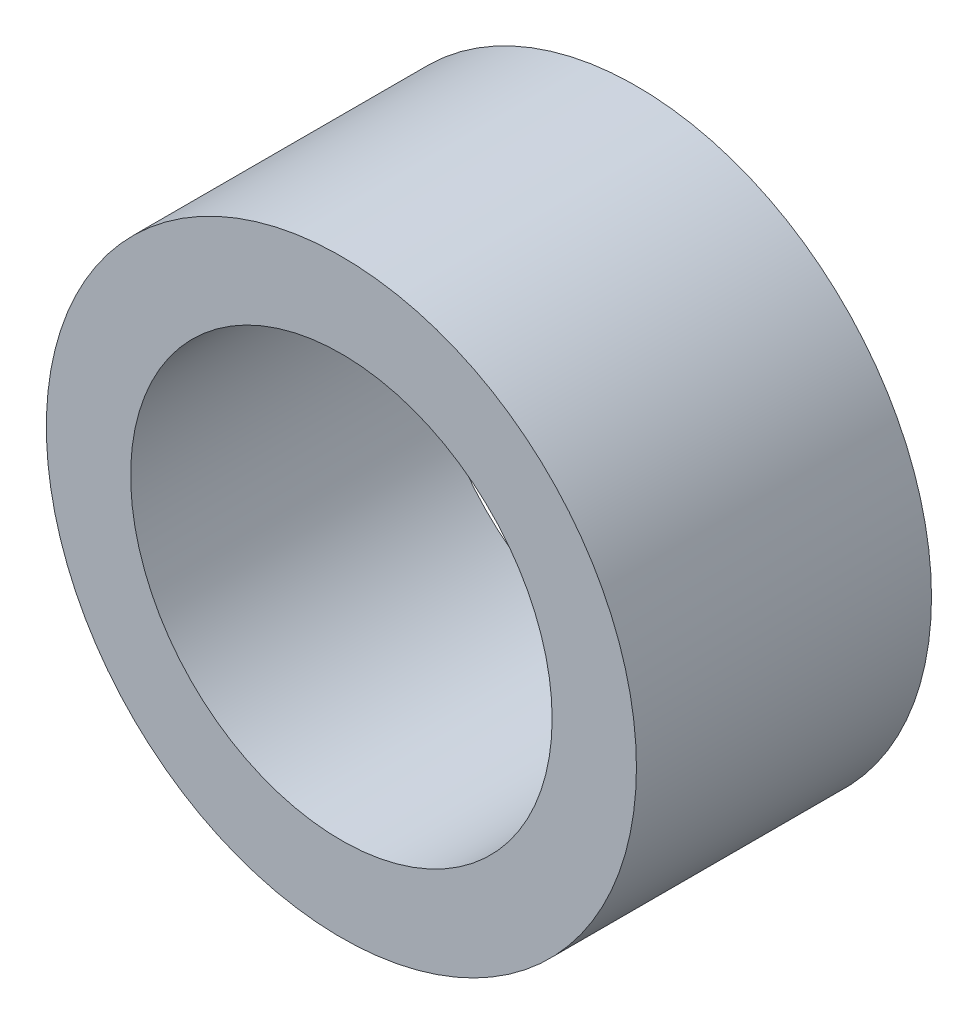
ISO-10303-21;
HEADER;
FILE_DESCRIPTION(('STEP AP214'),'2;1');
FILE_NAME('part.step','',(''),(''),'','','');
FILE_SCHEMA(('AUTOMOTIVE_DESIGN { 1 0 10303 214 1 1 1 1 }'));
ENDSEC;
DATA;
#1=APPLICATION_CONTEXT('core data for automotive mechanical design processes');
#2=APPLICATION_PROTOCOL_DEFINITION('international standard','automotive_design',2000,#1);
#3=PRODUCT_CONTEXT('',#1,'mechanical');
#4=PRODUCT('Part','Part','',(#3));
#5=PRODUCT_RELATED_PRODUCT_CATEGORY('part','',(#4));
#6=PRODUCT_DEFINITION_FORMATION('','',#4);
#7=PRODUCT_DEFINITION_CONTEXT('part definition',#1,'design');
#8=PRODUCT_DEFINITION('design','',#6,#7);
#9=PRODUCT_DEFINITION_SHAPE('','',#8);
#10=(LENGTH_UNIT() NAMED_UNIT(*) SI_UNIT(.MILLI.,.METRE.));
#11=(NAMED_UNIT(*) PLANE_ANGLE_UNIT() SI_UNIT($,.RADIAN.));
#12=(NAMED_UNIT(*) SI_UNIT($,.STERADIAN.) SOLID_ANGLE_UNIT());
#13=UNCERTAINTY_MEASURE_WITH_UNIT(LENGTH_MEASURE(1.E-05),#10,'distance_accuracy_value','');
#14=(GEOMETRIC_REPRESENTATION_CONTEXT(3) GLOBAL_UNCERTAINTY_ASSIGNED_CONTEXT((#13)) GLOBAL_UNIT_ASSIGNED_CONTEXT((#10,
#11,#12)) REPRESENTATION_CONTEXT('',''));
#15=CARTESIAN_POINT('',(0.,0.,0.));
#16=DIRECTION('',(0.,0.,1.));
#17=DIRECTION('',(1.,0.,0.));
#18=AXIS2_PLACEMENT_3D('',#15,#16,#17);
#19=CARTESIAN_POINT('',(0.,0.,3.5));
#20=DIRECTION('',(0.,0.,1.));
#21=DIRECTION('',(1.,0.,0.));
#22=AXIS2_PLACEMENT_3D('',#19,#20,#21);
#23=PLANE('',#22);
#24=CARTESIAN_POINT('',(0.,0.,3.5));
#25=DIRECTION('',(0.,0.,1.));
#26=DIRECTION('',(1.,0.,0.));
#27=AXIS2_PLACEMENT_3D('',#24,#25,#26);
#28=CIRCLE('',#27,3.5);
#29=CARTESIAN_POINT('',(3.5,0.,3.5));
#30=VERTEX_POINT('',#29);
#31=EDGE_CURVE('E10',#30,#30,#28,.T.);
#32=ORIENTED_EDGE('',*,*,#31,.T.);
#33=EDGE_LOOP('',(#32));
#34=FACE_BOUND('',#33,.T.);
#35=CARTESIAN_POINT('',(0.,0.,3.5));
#36=DIRECTION('',(0.,0.,1.));
#37=DIRECTION('',(1.,0.,0.));
#38=AXIS2_PLACEMENT_3D('',#35,#36,#37);
#39=CIRCLE('',#38,2.5);
#40=CARTESIAN_POINT('',(2.5,0.,3.5));
#41=VERTEX_POINT('',#40);
#42=EDGE_CURVE('E41',#41,#41,#39,.T.);
#43=ORIENTED_EDGE('',*,*,#42,.F.);
#44=EDGE_LOOP('',(#43));
#45=FACE_BOUND('',#44,.T.);
#46=ADVANCED_FACE('F30',(#34,#45),#23,.T.);
#47=CARTESIAN_POINT('',(0.,0.,0.));
#48=DIRECTION('',(0.,0.,1.));
#49=DIRECTION('',(1.,0.,0.));
#50=AXIS2_PLACEMENT_3D('',#47,#48,#49);
#51=PLANE('',#50);
#52=CARTESIAN_POINT('',(0.,0.,0.));
#53=DIRECTION('',(0.,0.,1.));
#54=DIRECTION('',(1.,0.,0.));
#55=AXIS2_PLACEMENT_3D('',#52,#53,#54);
#56=CIRCLE('',#55,3.5);
#57=CARTESIAN_POINT('',(3.5,0.,0.));
#58=VERTEX_POINT('',#57);
#59=EDGE_CURVE('E34',#58,#58,#56,.T.);
#60=ORIENTED_EDGE('',*,*,#59,.F.);
#61=EDGE_LOOP('',(#60));
#62=FACE_BOUND('',#61,.T.);
#63=CARTESIAN_POINT('',(0.,0.,0.));
#64=DIRECTION('',(0.,0.,1.));
#65=DIRECTION('',(1.,0.,0.));
#66=AXIS2_PLACEMENT_3D('',#63,#64,#65);
#67=CIRCLE('',#66,2.5);
#68=CARTESIAN_POINT('',(2.5,0.,0.));
#69=VERTEX_POINT('',#68);
#70=EDGE_CURVE('E43',#69,#69,#67,.T.);
#71=ORIENTED_EDGE('',*,*,#70,.T.);
#72=EDGE_LOOP('',(#71));
#73=FACE_BOUND('',#72,.T.);
#74=ADVANCED_FACE('F53',(#62,#73),#51,.F.);
#75=CARTESIAN_POINT('',(0.,0.,3.5));
#76=DIRECTION('',(0.,0.,-1.));
#77=DIRECTION('',(-1.,0.,0.));
#78=AXIS2_PLACEMENT_3D('',#75,#76,#77);
#79=CYLINDRICAL_SURFACE('',#78,3.5);
#80=ORIENTED_EDGE('',*,*,#31,.F.);
#81=EDGE_LOOP('',(#80));
#82=FACE_BOUND('',#81,.T.);
#83=ORIENTED_EDGE('',*,*,#59,.T.);
#84=EDGE_LOOP('',(#83));
#85=FACE_BOUND('',#84,.T.);
#86=ADVANCED_FACE('F32',(#82,#85),#79,.T.);
#87=CARTESIAN_POINT('',(0.,0.,3.5));
#88=DIRECTION('',(0.,0.,-1.));
#89=DIRECTION('',(-1.,0.,0.));
#90=AXIS2_PLACEMENT_3D('',#87,#88,#89);
#91=CYLINDRICAL_SURFACE('',#90,2.5);
#92=ORIENTED_EDGE('',*,*,#42,.T.);
#93=EDGE_LOOP('',(#92));
#94=FACE_BOUND('',#93,.T.);
#95=ORIENTED_EDGE('',*,*,#70,.F.);
#96=EDGE_LOOP('',(#95));
#97=FACE_BOUND('',#96,.T.);
#98=ADVANCED_FACE('F49',(#94,#97),#91,.F.);
#99=CLOSED_SHELL('',(#46,#74,#86,#98));
#100=MANIFOLD_SOLID_BREP('B2',#99);
#101=ADVANCED_BREP_SHAPE_REPRESENTATION('',(#18,#100),#14);
#102=SHAPE_DEFINITION_REPRESENTATION(#9,#101);
ENDSEC;
END-ISO-10303-21;
